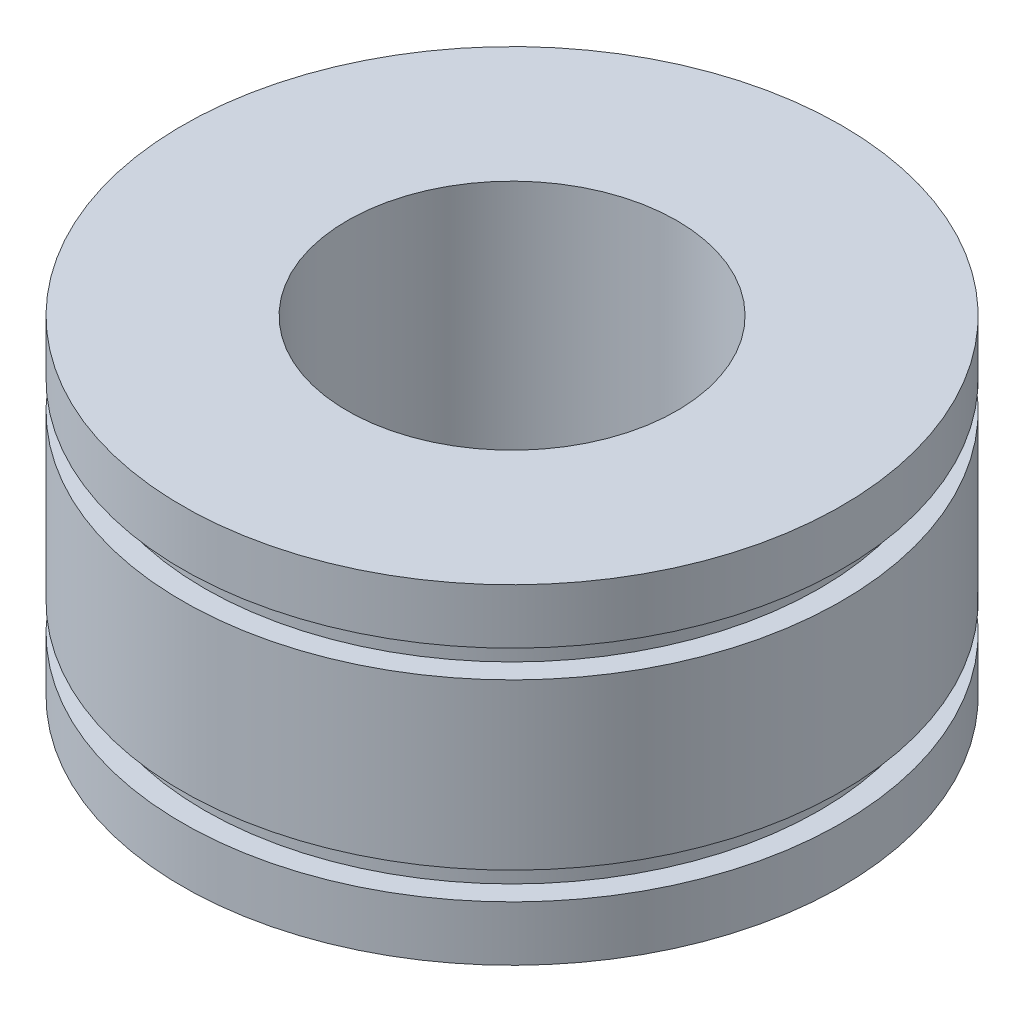
ISO-10303-21;
HEADER;
FILE_DESCRIPTION(('STEP AP214'),'2;1');
FILE_NAME('part.step','',(''),(''),'','','');
FILE_SCHEMA(('AUTOMOTIVE_DESIGN { 1 0 10303 214 1 1 1 1 }'));
ENDSEC;
DATA;
#1=APPLICATION_CONTEXT('core data for automotive mechanical design processes');
#2=APPLICATION_PROTOCOL_DEFINITION('international standard','automotive_design',2000,#1);
#3=PRODUCT_CONTEXT('',#1,'mechanical');
#4=PRODUCT('Part','Part','',(#3));
#5=PRODUCT_RELATED_PRODUCT_CATEGORY('part','',(#4));
#6=PRODUCT_DEFINITION_FORMATION('','',#4);
#7=PRODUCT_DEFINITION_CONTEXT('part definition',#1,'design');
#8=PRODUCT_DEFINITION('design','',#6,#7);
#9=PRODUCT_DEFINITION_SHAPE('','',#8);
#10=(LENGTH_UNIT() NAMED_UNIT(*) SI_UNIT(.MILLI.,.METRE.));
#11=(NAMED_UNIT(*) PLANE_ANGLE_UNIT() SI_UNIT($,.RADIAN.));
#12=(NAMED_UNIT(*) SI_UNIT($,.STERADIAN.) SOLID_ANGLE_UNIT());
#13=UNCERTAINTY_MEASURE_WITH_UNIT(LENGTH_MEASURE(1.E-05),#10,'distance_accuracy_value','');
#14=(GEOMETRIC_REPRESENTATION_CONTEXT(3) GLOBAL_UNCERTAINTY_ASSIGNED_CONTEXT((#13)) GLOBAL_UNIT_ASSIGNED_CONTEXT((#10,
#11,#12)) REPRESENTATION_CONTEXT('',''));
#15=CARTESIAN_POINT('',(0.,0.,0.));
#16=DIRECTION('',(0.,0.,1.));
#17=DIRECTION('',(1.,0.,0.));
#18=AXIS2_PLACEMENT_3D('',#15,#16,#17);
#19=CARTESIAN_POINT('',(0.,0.,0.));
#20=DIRECTION('',(0.,-1.,0.));
#21=DIRECTION('',(0.,0.,-1.));
#22=AXIS2_PLACEMENT_3D('',#19,#20,#21);
#23=CYLINDRICAL_SURFACE('',#22,1.5);
#24=CARTESIAN_POINT('',(0.,0.,0.));
#25=DIRECTION('',(0.,-1.,0.));
#26=DIRECTION('',(0.,0.,-1.));
#27=AXIS2_PLACEMENT_3D('',#24,#25,#26);
#28=CIRCLE('',#27,1.5);
#29=CARTESIAN_POINT('',(0.,0.,-1.5));
#30=VERTEX_POINT('',#29);
#31=EDGE_CURVE('E10',#30,#30,#28,.T.);
#32=ORIENTED_EDGE('',*,*,#31,.T.);
#33=EDGE_LOOP('',(#32));
#34=FACE_BOUND('',#33,.T.);
#35=CARTESIAN_POINT('',(0.,3.,0.));
#36=DIRECTION('',(0.,-1.,0.));
#37=DIRECTION('',(0.,0.,-1.));
#38=AXIS2_PLACEMENT_3D('',#35,#36,#37);
#39=CIRCLE('',#38,1.5);
#40=CARTESIAN_POINT('',(0.,3.,-1.5));
#41=VERTEX_POINT('',#40);
#42=EDGE_CURVE('E74',#41,#41,#39,.T.);
#43=ORIENTED_EDGE('',*,*,#42,.F.);
#44=EDGE_LOOP('',(#43));
#45=FACE_BOUND('',#44,.T.);
#46=ADVANCED_FACE('F34',(#34,#45),#23,.F.);
#47=CARTESIAN_POINT('',(0.,0.,0.));
#48=DIRECTION('',(0.,1.,0.));
#49=DIRECTION('',(0.,0.,1.));
#50=AXIS2_PLACEMENT_3D('',#47,#48,#49);
#51=PLANE('',#50);
#52=ORIENTED_EDGE('',*,*,#31,.F.);
#53=EDGE_LOOP('',(#52));
#54=FACE_BOUND('',#53,.T.);
#55=CARTESIAN_POINT('',(0.,0.,0.));
#56=DIRECTION('',(0.,-1.,0.));
#57=DIRECTION('',(0.,0.,-1.));
#58=AXIS2_PLACEMENT_3D('',#55,#56,#57);
#59=CIRCLE('',#58,3.);
#60=CARTESIAN_POINT('',(0.,0.,-3.));
#61=VERTEX_POINT('',#60);
#62=EDGE_CURVE('E40',#61,#61,#59,.T.);
#63=ORIENTED_EDGE('',*,*,#62,.T.);
#64=EDGE_LOOP('',(#63));
#65=FACE_BOUND('',#64,.T.);
#66=ADVANCED_FACE('F81',(#54,#65),#51,.F.);
#67=CARTESIAN_POINT('',(0.,0.,0.));
#68=DIRECTION('',(0.,-1.,0.));
#69=DIRECTION('',(0.,0.,-1.));
#70=AXIS2_PLACEMENT_3D('',#67,#68,#69);
#71=CYLINDRICAL_SURFACE('',#70,3.);
#72=ORIENTED_EDGE('',*,*,#62,.F.);
#73=EDGE_LOOP('',(#72));
#74=FACE_BOUND('',#73,.T.);
#75=CARTESIAN_POINT('',(0.,0.5,0.));
#76=DIRECTION('',(0.,-1.,0.));
#77=DIRECTION('',(0.,0.,-1.));
#78=AXIS2_PLACEMENT_3D('',#75,#76,#77);
#79=CIRCLE('',#78,3.);
#80=CARTESIAN_POINT('',(0.,0.5,-3.));
#81=VERTEX_POINT('',#80);
#82=EDGE_CURVE('E44',#81,#81,#79,.T.);
#83=ORIENTED_EDGE('',*,*,#82,.T.);
#84=EDGE_LOOP('',(#83));
#85=FACE_BOUND('',#84,.T.);
#86=ADVANCED_FACE('F85',(#74,#85),#71,.T.);
#87=CARTESIAN_POINT('',(0.,0.5,0.));
#88=DIRECTION('',(0.,-1.,0.));
#89=DIRECTION('',(0.,0.,-1.));
#90=AXIS2_PLACEMENT_3D('',#87,#88,#89);
#91=PLANE('',#90);
#92=ORIENTED_EDGE('',*,*,#82,.F.);
#93=EDGE_LOOP('',(#92));
#94=FACE_BOUND('',#93,.T.);
#95=CARTESIAN_POINT('',(0.,0.5,0.));
#96=DIRECTION('',(0.,-1.,0.));
#97=DIRECTION('',(0.,0.,-1.));
#98=AXIS2_PLACEMENT_3D('',#95,#96,#97);
#99=CIRCLE('',#98,2.8);
#100=CARTESIAN_POINT('',(0.,0.5,-2.8));
#101=VERTEX_POINT('',#100);
#102=EDGE_CURVE('E48',#101,#101,#99,.T.);
#103=ORIENTED_EDGE('',*,*,#102,.T.);
#104=EDGE_LOOP('',(#103));
#105=FACE_BOUND('',#104,.T.);
#106=ADVANCED_FACE('F90',(#94,#105),#91,.F.);
#107=CARTESIAN_POINT('',(0.,0.,0.));
#108=DIRECTION('',(0.,-1.,0.));
#109=DIRECTION('',(0.,0.,-1.));
#110=AXIS2_PLACEMENT_3D('',#107,#108,#109);
#111=CYLINDRICAL_SURFACE('',#110,2.8);
#112=ORIENTED_EDGE('',*,*,#102,.F.);
#113=EDGE_LOOP('',(#112));
#114=FACE_BOUND('',#113,.T.);
#115=CARTESIAN_POINT('',(0.,0.75,0.));
#116=DIRECTION('',(0.,-1.,0.));
#117=DIRECTION('',(0.,0.,-1.));
#118=AXIS2_PLACEMENT_3D('',#115,#116,#117);
#119=CIRCLE('',#118,2.8);
#120=CARTESIAN_POINT('',(0.,0.75,-2.8));
#121=VERTEX_POINT('',#120);
#122=EDGE_CURVE('E53',#121,#121,#119,.T.);
#123=ORIENTED_EDGE('',*,*,#122,.T.);
#124=EDGE_LOOP('',(#123));
#125=FACE_BOUND('',#124,.T.);
#126=ADVANCED_FACE('F96',(#114,#125),#111,.T.);
#127=CARTESIAN_POINT('',(0.,0.75,0.));
#128=DIRECTION('',(0.,1.,0.));
#129=DIRECTION('',(0.,0.,1.));
#130=AXIS2_PLACEMENT_3D('',#127,#128,#129);
#131=PLANE('',#130);
#132=ORIENTED_EDGE('',*,*,#122,.F.);
#133=EDGE_LOOP('',(#132));
#134=FACE_BOUND('',#133,.T.);
#135=CARTESIAN_POINT('',(0.,0.75,0.));
#136=DIRECTION('',(0.,-1.,0.));
#137=DIRECTION('',(0.,0.,-1.));
#138=AXIS2_PLACEMENT_3D('',#135,#136,#137);
#139=CIRCLE('',#138,3.);
#140=CARTESIAN_POINT('',(0.,0.75,-3.));
#141=VERTEX_POINT('',#140);
#142=EDGE_CURVE('E56',#141,#141,#139,.T.);
#143=ORIENTED_EDGE('',*,*,#142,.T.);
#144=EDGE_LOOP('',(#143));
#145=FACE_BOUND('',#144,.T.);
#146=ADVANCED_FACE('F100',(#134,#145),#131,.F.);
#147=CARTESIAN_POINT('',(0.,0.,0.));
#148=DIRECTION('',(0.,-1.,0.));
#149=DIRECTION('',(0.,0.,-1.));
#150=AXIS2_PLACEMENT_3D('',#147,#148,#149);
#151=CYLINDRICAL_SURFACE('',#150,3.);
#152=ORIENTED_EDGE('',*,*,#142,.F.);
#153=EDGE_LOOP('',(#152));
#154=FACE_BOUND('',#153,.T.);
#155=CARTESIAN_POINT('',(0.,2.25,0.));
#156=DIRECTION('',(0.,-1.,0.));
#157=DIRECTION('',(0.,0.,-1.));
#158=AXIS2_PLACEMENT_3D('',#155,#156,#157);
#159=CIRCLE('',#158,3.);
#160=CARTESIAN_POINT('',(0.,2.25,-3.));
#161=VERTEX_POINT('',#160);
#162=EDGE_CURVE('E59',#161,#161,#159,.T.);
#163=ORIENTED_EDGE('',*,*,#162,.T.);
#164=EDGE_LOOP('',(#163));
#165=FACE_BOUND('',#164,.T.);
#166=ADVANCED_FACE('F104',(#154,#165),#151,.T.);
#167=CARTESIAN_POINT('',(0.,2.25,0.));
#168=DIRECTION('',(0.,-1.,0.));
#169=DIRECTION('',(0.,0.,-1.));
#170=AXIS2_PLACEMENT_3D('',#167,#168,#169);
#171=PLANE('',#170);
#172=ORIENTED_EDGE('',*,*,#162,.F.);
#173=EDGE_LOOP('',(#172));
#174=FACE_BOUND('',#173,.T.);
#175=CARTESIAN_POINT('',(0.,2.25,0.));
#176=DIRECTION('',(0.,-1.,0.));
#177=DIRECTION('',(0.,0.,-1.));
#178=AXIS2_PLACEMENT_3D('',#175,#176,#177);
#179=CIRCLE('',#178,2.8);
#180=CARTESIAN_POINT('',(0.,2.25,-2.8));
#181=VERTEX_POINT('',#180);
#182=EDGE_CURVE('E62',#181,#181,#179,.T.);
#183=ORIENTED_EDGE('',*,*,#182,.T.);
#184=EDGE_LOOP('',(#183));
#185=FACE_BOUND('',#184,.T.);
#186=ADVANCED_FACE('F108',(#174,#185),#171,.F.);
#187=CARTESIAN_POINT('',(0.,0.,0.));
#188=DIRECTION('',(0.,-1.,0.));
#189=DIRECTION('',(0.,0.,-1.));
#190=AXIS2_PLACEMENT_3D('',#187,#188,#189);
#191=CYLINDRICAL_SURFACE('',#190,2.8);
#192=ORIENTED_EDGE('',*,*,#182,.F.);
#193=EDGE_LOOP('',(#192));
#194=FACE_BOUND('',#193,.T.);
#195=CARTESIAN_POINT('',(0.,2.5,0.));
#196=DIRECTION('',(0.,-1.,0.));
#197=DIRECTION('',(0.,0.,-1.));
#198=AXIS2_PLACEMENT_3D('',#195,#196,#197);
#199=CIRCLE('',#198,2.8);
#200=CARTESIAN_POINT('',(0.,2.5,-2.8));
#201=VERTEX_POINT('',#200);
#202=EDGE_CURVE('E65',#201,#201,#199,.T.);
#203=ORIENTED_EDGE('',*,*,#202,.T.);
#204=EDGE_LOOP('',(#203));
#205=FACE_BOUND('',#204,.T.);
#206=ADVANCED_FACE('F112',(#194,#205),#191,.T.);
#207=CARTESIAN_POINT('',(0.,2.5,0.));
#208=DIRECTION('',(0.,1.,0.));
#209=DIRECTION('',(0.,0.,1.));
#210=AXIS2_PLACEMENT_3D('',#207,#208,#209);
#211=PLANE('',#210);
#212=ORIENTED_EDGE('',*,*,#202,.F.);
#213=EDGE_LOOP('',(#212));
#214=FACE_BOUND('',#213,.T.);
#215=CARTESIAN_POINT('',(0.,2.5,0.));
#216=DIRECTION('',(0.,-1.,0.));
#217=DIRECTION('',(0.,0.,-1.));
#218=AXIS2_PLACEMENT_3D('',#215,#216,#217);
#219=CIRCLE('',#218,3.);
#220=CARTESIAN_POINT('',(0.,2.5,-3.));
#221=VERTEX_POINT('',#220);
#222=EDGE_CURVE('E68',#221,#221,#219,.T.);
#223=ORIENTED_EDGE('',*,*,#222,.T.);
#224=EDGE_LOOP('',(#223));
#225=FACE_BOUND('',#224,.T.);
#226=ADVANCED_FACE('F116',(#214,#225),#211,.F.);
#227=CARTESIAN_POINT('',(0.,0.,0.));
#228=DIRECTION('',(0.,-1.,0.));
#229=DIRECTION('',(0.,0.,-1.));
#230=AXIS2_PLACEMENT_3D('',#227,#228,#229);
#231=CYLINDRICAL_SURFACE('',#230,3.);
#232=ORIENTED_EDGE('',*,*,#222,.F.);
#233=EDGE_LOOP('',(#232));
#234=FACE_BOUND('',#233,.T.);
#235=CARTESIAN_POINT('',(0.,3.,0.));
#236=DIRECTION('',(0.,-1.,0.));
#237=DIRECTION('',(0.,0.,-1.));
#238=AXIS2_PLACEMENT_3D('',#235,#236,#237);
#239=CIRCLE('',#238,3.);
#240=CARTESIAN_POINT('',(0.,3.,-3.));
#241=VERTEX_POINT('',#240);
#242=EDGE_CURVE('E71',#241,#241,#239,.T.);
#243=ORIENTED_EDGE('',*,*,#242,.T.);
#244=EDGE_LOOP('',(#243));
#245=FACE_BOUND('',#244,.T.);
#246=ADVANCED_FACE('F120',(#234,#245),#231,.T.);
#247=CARTESIAN_POINT('',(0.,3.,0.));
#248=DIRECTION('',(0.,-1.,0.));
#249=DIRECTION('',(0.,0.,-1.));
#250=AXIS2_PLACEMENT_3D('',#247,#248,#249);
#251=PLANE('',#250);
#252=ORIENTED_EDGE('',*,*,#242,.F.);
#253=EDGE_LOOP('',(#252));
#254=FACE_BOUND('',#253,.T.);
#255=ORIENTED_EDGE('',*,*,#42,.T.);
#256=EDGE_LOOP('',(#255));
#257=FACE_BOUND('',#256,.T.);
#258=ADVANCED_FACE('F78',(#254,#257),#251,.F.);
#259=CLOSED_SHELL('',(#46,#66,#86,#106,#126,#146,#166,#186,#206,#226,#246,#258));
#260=MANIFOLD_SOLID_BREP('B2',#259);
#261=ADVANCED_BREP_SHAPE_REPRESENTATION('',(#18,#260),#14);
#262=SHAPE_DEFINITION_REPRESENTATION(#9,#261);
ENDSEC;
END-ISO-10303-21;
